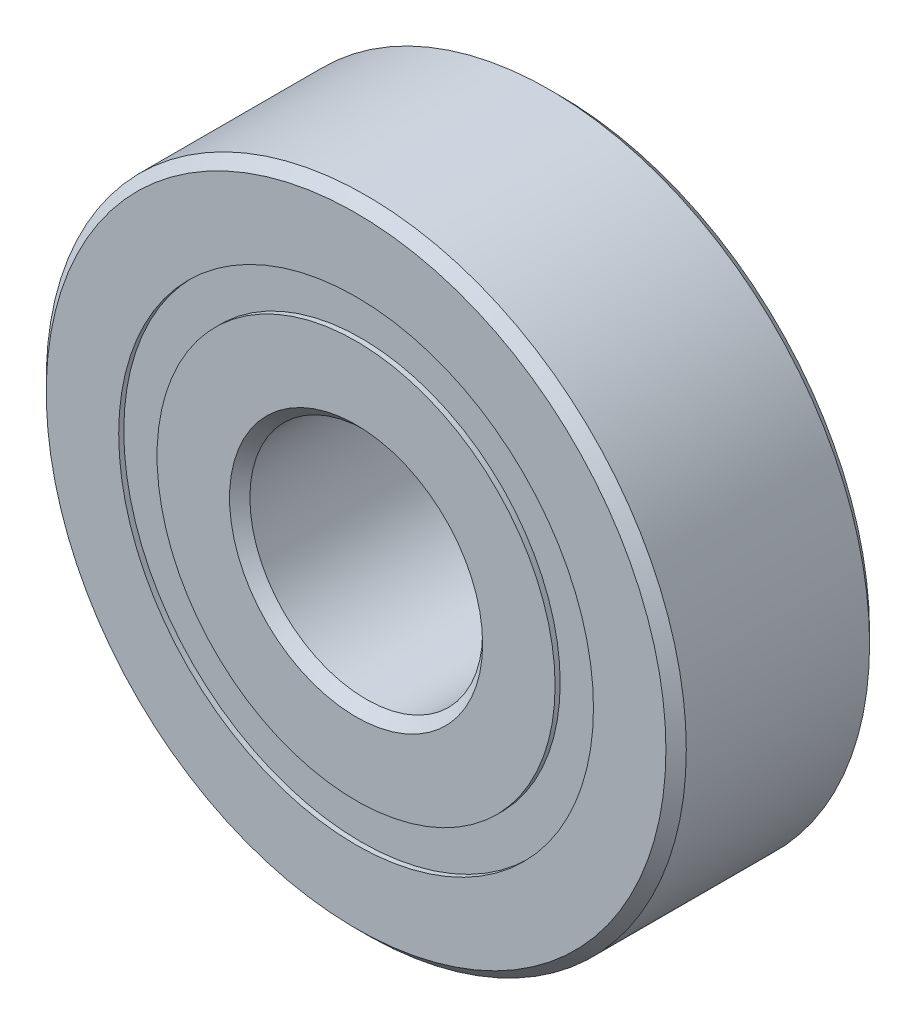
ISO-10303-21;
HEADER;
FILE_DESCRIPTION(('STEP AP214'),'2;1');
FILE_NAME('part.step','',(''),(''),'','','');
FILE_SCHEMA(('AUTOMOTIVE_DESIGN { 1 0 10303 214 1 1 1 1 }'));
ENDSEC;
DATA;
#1=APPLICATION_CONTEXT('core data for automotive mechanical design processes');
#2=APPLICATION_PROTOCOL_DEFINITION('international standard','automotive_design',2000,#1);
#3=PRODUCT_CONTEXT('',#1,'mechanical');
#4=PRODUCT('Part','Part','',(#3));
#5=PRODUCT_RELATED_PRODUCT_CATEGORY('part','',(#4));
#6=PRODUCT_DEFINITION_FORMATION('','',#4);
#7=PRODUCT_DEFINITION_CONTEXT('part definition',#1,'design');
#8=PRODUCT_DEFINITION('design','',#6,#7);
#9=PRODUCT_DEFINITION_SHAPE('','',#8);
#10=(LENGTH_UNIT() NAMED_UNIT(*) SI_UNIT(.MILLI.,.METRE.));
#11=(NAMED_UNIT(*) PLANE_ANGLE_UNIT() SI_UNIT($,.RADIAN.));
#12=(NAMED_UNIT(*) SI_UNIT($,.STERADIAN.) SOLID_ANGLE_UNIT());
#13=UNCERTAINTY_MEASURE_WITH_UNIT(LENGTH_MEASURE(1.E-05),#10,'distance_accuracy_value','');
#14=(GEOMETRIC_REPRESENTATION_CONTEXT(3) GLOBAL_UNCERTAINTY_ASSIGNED_CONTEXT((#13)) GLOBAL_UNIT_ASSIGNED_CONTEXT((#10,
#11,#12)) REPRESENTATION_CONTEXT('',''));
#15=CARTESIAN_POINT('',(0.,0.,0.));
#16=DIRECTION('',(0.,0.,1.));
#17=DIRECTION('',(1.,0.,0.));
#18=AXIS2_PLACEMENT_3D('',#15,#16,#17);
#19=CARTESIAN_POINT('',(0.,8.15934065934066,-3.325));
#20=DIRECTION('',(0.,0.,1.));
#21=DIRECTION('',(1.,0.,0.));
#22=AXIS2_PLACEMENT_3D('',#19,#20,#21);
#23=PLANE('',#22);
#24=CARTESIAN_POINT('',(0.,0.,-3.325));
#25=DIRECTION('',(0.,0.,1.));
#26=DIRECTION('',(1.,0.,0.));
#27=AXIS2_PLACEMENT_3D('',#24,#25,#26);
#28=CIRCLE('',#27,8.15934065934066);
#29=CARTESIAN_POINT('',(8.15934065934066,0.,-3.325));
#30=VERTEX_POINT('',#29);
#31=EDGE_CURVE('E57',#30,#30,#28,.T.);
#32=ORIENTED_EDGE('',*,*,#31,.F.);
#33=EDGE_LOOP('',(#32));
#34=FACE_BOUND('',#33,.T.);
#35=CARTESIAN_POINT('',(0.,0.,-3.325));
#36=DIRECTION('',(0.,0.,1.));
#37=DIRECTION('',(1.,0.,0.));
#38=AXIS2_PLACEMENT_3D('',#35,#36,#37);
#39=CIRCLE('',#38,6.84065934065934);
#40=CARTESIAN_POINT('',(6.84065934065934,0.,-3.325));
#41=VERTEX_POINT('',#40);
#42=EDGE_CURVE('E11',#41,#41,#39,.T.);
#43=ORIENTED_EDGE('',*,*,#42,.T.);
#44=EDGE_LOOP('',(#43));
#45=FACE_BOUND('',#44,.T.);
#46=ADVANCED_FACE('F43',(#34,#45),#23,.F.);
#47=CARTESIAN_POINT('',(0.,0.,3.5));
#48=DIRECTION('',(0.,0.,1.));
#49=DIRECTION('',(1.,0.,0.));
#50=AXIS2_PLACEMENT_3D('',#47,#48,#49);
#51=CYLINDRICAL_SURFACE('',#50,6.84065934065934);
#52=ORIENTED_EDGE('',*,*,#42,.F.);
#53=EDGE_LOOP('',(#52));
#54=FACE_BOUND('',#53,.T.);
#55=CARTESIAN_POINT('',(0.,0.,-1.68952158656808));
#56=DIRECTION('',(0.,0.,1.));
#57=DIRECTION('',(1.,0.,0.));
#58=AXIS2_PLACEMENT_3D('',#55,#56,#57);
#59=CIRCLE('',#58,6.84065934065934);
#60=CARTESIAN_POINT('',(6.84065934065934,0.,-1.68952158656808));
#61=VERTEX_POINT('',#60);
#62=EDGE_CURVE('E49',#61,#61,#59,.T.);
#63=ORIENTED_EDGE('',*,*,#62,.T.);
#64=EDGE_LOOP('',(#63));
#65=FACE_BOUND('',#64,.T.);
#66=ADVANCED_FACE('F66',(#54,#65),#51,.F.);
#67=CARTESIAN_POINT('',(0.,8.15934065934066,-1.68952158656808));
#68=DIRECTION('',(0.,0.,-1.));
#69=DIRECTION('',(-1.,0.,0.));
#70=AXIS2_PLACEMENT_3D('',#67,#68,#69);
#71=PLANE('',#70);
#72=ORIENTED_EDGE('',*,*,#62,.F.);
#73=EDGE_LOOP('',(#72));
#74=FACE_BOUND('',#73,.T.);
#75=CARTESIAN_POINT('',(0.,0.,-1.68952158656808));
#76=DIRECTION('',(0.,0.,1.));
#77=DIRECTION('',(1.,0.,0.));
#78=AXIS2_PLACEMENT_3D('',#75,#76,#77);
#79=CIRCLE('',#78,8.15934065934066);
#80=CARTESIAN_POINT('',(8.15934065934066,0.,-1.68952158656808));
#81=VERTEX_POINT('',#80);
#82=EDGE_CURVE('E53',#81,#81,#79,.T.);
#83=ORIENTED_EDGE('',*,*,#82,.T.);
#84=EDGE_LOOP('',(#83));
#85=FACE_BOUND('',#84,.T.);
#86=ADVANCED_FACE('F70',(#74,#85),#71,.F.);
#87=CARTESIAN_POINT('',(0.,0.,3.5));
#88=DIRECTION('',(0.,0.,1.));
#89=DIRECTION('',(1.,0.,0.));
#90=AXIS2_PLACEMENT_3D('',#87,#88,#89);
#91=CYLINDRICAL_SURFACE('',#90,8.15934065934066);
#92=ORIENTED_EDGE('',*,*,#82,.F.);
#93=EDGE_LOOP('',(#92));
#94=FACE_BOUND('',#93,.T.);
#95=ORIENTED_EDGE('',*,*,#31,.T.);
#96=EDGE_LOOP('',(#95));
#97=FACE_BOUND('',#96,.T.);
#98=ADVANCED_FACE('F63',(#94,#97),#91,.T.);
#99=CLOSED_SHELL('',(#46,#66,#86,#98));
#100=MANIFOLD_SOLID_BREP('B2',#99);
#101=CARTESIAN_POINT('',(0.,8.15934065934066,3.325));
#102=DIRECTION('',(0.,0.,-1.));
#103=DIRECTION('',(-1.,0.,0.));
#104=AXIS2_PLACEMENT_3D('',#101,#102,#103);
#105=PLANE('',#104);
#106=CARTESIAN_POINT('',(0.,0.,3.325));
#107=DIRECTION('',(0.,0.,1.));
#108=DIRECTION('',(1.,0.,0.));
#109=AXIS2_PLACEMENT_3D('',#106,#107,#108);
#110=CIRCLE('',#109,6.84065934065934);
#111=CARTESIAN_POINT('',(6.84065934065934,0.,3.325));
#112=VERTEX_POINT('',#111);
#113=EDGE_CURVE('E42',#112,#112,#110,.T.);
#114=ORIENTED_EDGE('',*,*,#113,.F.);
#115=EDGE_LOOP('',(#114));
#116=FACE_BOUND('',#115,.T.);
#117=CARTESIAN_POINT('',(0.,0.,3.325));
#118=DIRECTION('',(0.,0.,1.));
#119=DIRECTION('',(1.,0.,0.));
#120=AXIS2_PLACEMENT_3D('',#117,#118,#119);
#121=CIRCLE('',#120,8.15934065934066);
#122=CARTESIAN_POINT('',(8.15934065934066,0.,3.325));
#123=VERTEX_POINT('',#122);
#124=EDGE_CURVE('E124',#123,#123,#121,.T.);
#125=ORIENTED_EDGE('',*,*,#124,.T.);
#126=EDGE_LOOP('',(#125));
#127=FACE_BOUND('',#126,.T.);
#128=ADVANCED_FACE('F110',(#116,#127),#105,.F.);
#129=CARTESIAN_POINT('',(0.,0.,3.5));
#130=DIRECTION('',(0.,0.,1.));
#131=DIRECTION('',(1.,0.,0.));
#132=AXIS2_PLACEMENT_3D('',#129,#130,#131);
#133=CYLINDRICAL_SURFACE('',#132,6.84065934065934);
#134=CARTESIAN_POINT('',(0.,0.,1.68952158656808));
#135=DIRECTION('',(0.,0.,1.));
#136=DIRECTION('',(1.,0.,0.));
#137=AXIS2_PLACEMENT_3D('',#134,#135,#136);
#138=CIRCLE('',#137,6.84065934065934);
#139=CARTESIAN_POINT('',(6.84065934065934,0.,1.68952158656808));
#140=VERTEX_POINT('',#139);
#141=EDGE_CURVE('E116',#140,#140,#138,.T.);
#142=ORIENTED_EDGE('',*,*,#141,.F.);
#143=EDGE_LOOP('',(#142));
#144=FACE_BOUND('',#143,.T.);
#145=ORIENTED_EDGE('',*,*,#113,.T.);
#146=EDGE_LOOP('',(#145));
#147=FACE_BOUND('',#146,.T.);
#148=ADVANCED_FACE('F139',(#144,#147),#133,.F.);
#149=CARTESIAN_POINT('',(0.,8.15934065934066,1.68952158656808));
#150=DIRECTION('',(0.,0.,1.));
#151=DIRECTION('',(1.,0.,0.));
#152=AXIS2_PLACEMENT_3D('',#149,#150,#151);
#153=PLANE('',#152);
#154=CARTESIAN_POINT('',(0.,0.,1.68952158656808));
#155=DIRECTION('',(0.,0.,1.));
#156=DIRECTION('',(1.,0.,0.));
#157=AXIS2_PLACEMENT_3D('',#154,#155,#156);
#158=CIRCLE('',#157,8.15934065934066);
#159=CARTESIAN_POINT('',(8.15934065934066,0.,1.68952158656808));
#160=VERTEX_POINT('',#159);
#161=EDGE_CURVE('E120',#160,#160,#158,.T.);
#162=ORIENTED_EDGE('',*,*,#161,.F.);
#163=EDGE_LOOP('',(#162));
#164=FACE_BOUND('',#163,.T.);
#165=ORIENTED_EDGE('',*,*,#141,.T.);
#166=EDGE_LOOP('',(#165));
#167=FACE_BOUND('',#166,.T.);
#168=ADVANCED_FACE('F134',(#164,#167),#153,.F.);
#169=CARTESIAN_POINT('',(0.,0.,3.5));
#170=DIRECTION('',(0.,0.,1.));
#171=DIRECTION('',(1.,0.,0.));
#172=AXIS2_PLACEMENT_3D('',#169,#170,#171);
#173=CYLINDRICAL_SURFACE('',#172,8.15934065934066);
#174=ORIENTED_EDGE('',*,*,#124,.F.);
#175=EDGE_LOOP('',(#174));
#176=FACE_BOUND('',#175,.T.);
#177=ORIENTED_EDGE('',*,*,#161,.T.);
#178=EDGE_LOOP('',(#177));
#179=FACE_BOUND('',#178,.T.);
#180=ADVANCED_FACE('F131',(#176,#179),#173,.T.);
#181=CLOSED_SHELL('',(#128,#148,#168,#180));
#182=MANIFOLD_SOLID_BREP('B6',#181);
#183=CARTESIAN_POINT('',(-3.2541280433816,6.75726650926819,0.));
#184=DIRECTION('',(0.,0.,1.));
#185=DIRECTION('',(-0.433883739117546,0.900968867902425,0.));
#186=AXIS2_PLACEMENT_3D('',#183,#184,#185);
#187=SPHERICAL_SURFACE('',#186,1.68952158656808);
#188=CARTESIAN_POINT('',(-3.2541280433816,6.75726650926819,1.68952158656808));
#189=VERTEX_POINT('',#188);
#190=VERTEX_LOOP('',#189);
#191=FACE_BOUND('',#190,.T.);
#192=ADVANCED_FACE('F177',(#191),#187,.T.);
#193=CLOSED_SHELL('',(#192));
#194=MANIFOLD_SOLID_BREP('B37',#193);
#195=CARTESIAN_POINT('',(-5.86373611851017,4.67617351394057,0.));
#196=DIRECTION('',(0.,0.,1.));
#197=DIRECTION('',(-0.781831482468022,0.623489801858743,0.));
#198=AXIS2_PLACEMENT_3D('',#195,#196,#197);
#199=SPHERICAL_SURFACE('',#198,1.68952158656808);
#200=CARTESIAN_POINT('',(-5.86373611851017,4.67617351394057,1.68952158656808));
#201=VERTEX_POINT('',#200);
#202=VERTEX_LOOP('',#201);
#203=FACE_BOUND('',#202,.T.);
#204=ADVANCED_FACE('F208',(#203),#199,.T.);
#205=CLOSED_SHELL('',(#204));
#206=MANIFOLD_SOLID_BREP('B106',#205);
#207=CARTESIAN_POINT('',(-7.31195934136366,1.66890700467243,0.));
#208=DIRECTION('',(0.,0.,1.));
#209=DIRECTION('',(-0.974927912181821,0.222520933956325,0.));
#210=AXIS2_PLACEMENT_3D('',#207,#208,#209);
#211=SPHERICAL_SURFACE('',#210,1.68952158656808);
#212=CARTESIAN_POINT('',(-7.31195934136366,1.66890700467243,1.68952158656808));
#213=VERTEX_POINT('',#212);
#214=VERTEX_LOOP('',#213);
#215=FACE_BOUND('',#214,.T.);
#216=ADVANCED_FACE('F239',(#215),#211,.T.);
#217=CLOSED_SHELL('',(#216));
#218=MANIFOLD_SOLID_BREP('B173',#217);
#219=CARTESIAN_POINT('',(-7.31195934136369,-1.66890700467229,0.));
#220=DIRECTION('',(0.,0.,1.));
#221=DIRECTION('',(-0.974927912181826,-0.222520933956305,0.));
#222=AXIS2_PLACEMENT_3D('',#219,#220,#221);
#223=SPHERICAL_SURFACE('',#222,1.68952158656808);
#224=CARTESIAN_POINT('',(-7.31195934136369,-1.66890700467229,1.68952158656808));
#225=VERTEX_POINT('',#224);
#226=VERTEX_LOOP('',#225);
#227=FACE_BOUND('',#226,.T.);
#228=ADVANCED_FACE('F270',(#227),#223,.T.);
#229=CLOSED_SHELL('',(#228));
#230=MANIFOLD_SOLID_BREP('B204',#229);
#231=CARTESIAN_POINT('',(-5.86373611851026,-4.67617351394045,0.));
#232=DIRECTION('',(0.,0.,1.));
#233=DIRECTION('',(-0.781831482468035,-0.623489801858727,0.));
#234=AXIS2_PLACEMENT_3D('',#231,#232,#233);
#235=SPHERICAL_SURFACE('',#234,1.68952158656808);
#236=CARTESIAN_POINT('',(-5.86373611851026,-4.67617351394045,1.68952158656808));
#237=VERTEX_POINT('',#236);
#238=VERTEX_LOOP('',#237);
#239=FACE_BOUND('',#238,.T.);
#240=ADVANCED_FACE('F303',(#239),#235,.T.);
#241=CLOSED_SHELL('',(#240));
#242=MANIFOLD_SOLID_BREP('B235',#241);
#243=CARTESIAN_POINT('',(-3.25412804338174,-6.75726650926812,0.));
#244=DIRECTION('',(0.,0.,1.));
#245=DIRECTION('',(-0.433883739117565,-0.900968867902416,0.));
#246=AXIS2_PLACEMENT_3D('',#243,#244,#245);
#247=SPHERICAL_SURFACE('',#246,1.68952158656808);
#248=CARTESIAN_POINT('',(-3.25412804338174,-6.75726650926812,1.68952158656808));
#249=VERTEX_POINT('',#248);
#250=VERTEX_LOOP('',#249);
#251=FACE_BOUND('',#250,.T.);
#252=ADVANCED_FACE('F334',(#251),#247,.T.);
#253=CLOSED_SHELL('',(#252));
#254=MANIFOLD_SOLID_BREP('B266',#253);
#255=CARTESIAN_POINT('',(0.,-7.5,0.));
#256=DIRECTION('',(0.,0.,1.));
#257=DIRECTION('',(0.,-1.,0.));
#258=AXIS2_PLACEMENT_3D('',#255,#256,#257);
#259=SPHERICAL_SURFACE('',#258,1.68952158656808);
#260=CARTESIAN_POINT('',(0.,-7.5,1.68952158656808));
#261=VERTEX_POINT('',#260);
#262=VERTEX_LOOP('',#261);
#263=FACE_BOUND('',#262,.T.);
#264=ADVANCED_FACE('F365',(#263),#259,.T.);
#265=CLOSED_SHELL('',(#264));
#266=MANIFOLD_SOLID_BREP('B299',#265);
#267=CARTESIAN_POINT('',(3.25412804338164,-6.75726650926816,0.));
#268=DIRECTION('',(0.,0.,1.));
#269=DIRECTION('',(0.433883739117553,-0.900968867902422,0.));
#270=AXIS2_PLACEMENT_3D('',#267,#268,#269);
#271=SPHERICAL_SURFACE('',#270,1.68952158656808);
#272=CARTESIAN_POINT('',(3.25412804338164,-6.75726650926816,1.68952158656808));
#273=VERTEX_POINT('',#272);
#274=VERTEX_LOOP('',#273);
#275=FACE_BOUND('',#274,.T.);
#276=ADVANCED_FACE('F398',(#275),#271,.T.);
#277=CLOSED_SHELL('',(#276));
#278=MANIFOLD_SOLID_BREP('B330',#277);
#279=CARTESIAN_POINT('',(5.8637361185102,-4.67617351394053,0.));
#280=DIRECTION('',(0.,0.,1.));
#281=DIRECTION('',(0.781831482468027,-0.623489801858737,0.));
#282=AXIS2_PLACEMENT_3D('',#279,#280,#281);
#283=SPHERICAL_SURFACE('',#282,1.68952158656808);
#284=CARTESIAN_POINT('',(5.8637361185102,-4.67617351394053,1.68952158656808));
#285=VERTEX_POINT('',#284);
#286=VERTEX_LOOP('',#285);
#287=FACE_BOUND('',#286,.T.);
#288=ADVANCED_FACE('F429',(#287),#283,.T.);
#289=CLOSED_SHELL('',(#288));
#290=MANIFOLD_SOLID_BREP('B361',#289);
#291=CARTESIAN_POINT('',(7.31195934136367,-1.66890700467239,0.));
#292=DIRECTION('',(0.,0.,1.));
#293=DIRECTION('',(0.974927912181823,-0.222520933956318,0.));
#294=AXIS2_PLACEMENT_3D('',#291,#292,#293);
#295=SPHERICAL_SURFACE('',#294,1.68952158656808);
#296=CARTESIAN_POINT('',(7.31195934136367,-1.66890700467239,1.68952158656808));
#297=VERTEX_POINT('',#296);
#298=VERTEX_LOOP('',#297);
#299=FACE_BOUND('',#298,.T.);
#300=ADVANCED_FACE('F460',(#299),#295,.T.);
#301=CLOSED_SHELL('',(#300));
#302=MANIFOLD_SOLID_BREP('B394',#301);
#303=CARTESIAN_POINT('',(7.31195934136368,1.66890700467234,0.));
#304=DIRECTION('',(0.,0.,1.));
#305=DIRECTION('',(0.974927912181824,0.222520933956311,0.));
#306=AXIS2_PLACEMENT_3D('',#303,#304,#305);
#307=SPHERICAL_SURFACE('',#306,1.68952158656808);
#308=CARTESIAN_POINT('',(7.31195934136368,1.66890700467234,1.68952158656808));
#309=VERTEX_POINT('',#308);
#310=VERTEX_LOOP('',#309);
#311=FACE_BOUND('',#310,.T.);
#312=ADVANCED_FACE('F491',(#311),#307,.T.);
#313=CLOSED_SHELL('',(#312));
#314=MANIFOLD_SOLID_BREP('B425',#313);
#315=CARTESIAN_POINT('',(5.86373611851023,4.67617351394049,0.));
#316=DIRECTION('',(0.,0.,1.));
#317=DIRECTION('',(0.781831482468031,0.623489801858732,0.));
#318=AXIS2_PLACEMENT_3D('',#315,#316,#317);
#319=SPHERICAL_SURFACE('',#318,1.68952158656808);
#320=CARTESIAN_POINT('',(5.86373611851023,4.67617351394049,1.68952158656808));
#321=VERTEX_POINT('',#320);
#322=VERTEX_LOOP('',#321);
#323=FACE_BOUND('',#322,.T.);
#324=ADVANCED_FACE('F522',(#323),#319,.T.);
#325=CLOSED_SHELL('',(#324));
#326=MANIFOLD_SOLID_BREP('B456',#325);
#327=CARTESIAN_POINT('',(3.25412804338169,6.75726650926814,0.));
#328=DIRECTION('',(0.,0.,1.));
#329=DIRECTION('',(0.433883739117559,0.900968867902419,0.));
#330=AXIS2_PLACEMENT_3D('',#327,#328,#329);
#331=SPHERICAL_SURFACE('',#330,1.68952158656808);
#332=CARTESIAN_POINT('',(3.25412804338169,6.75726650926814,1.68952158656808));
#333=VERTEX_POINT('',#332);
#334=VERTEX_LOOP('',#333);
#335=FACE_BOUND('',#334,.T.);
#336=ADVANCED_FACE('F555',(#335),#331,.T.);
#337=CLOSED_SHELL('',(#336));
#338=MANIFOLD_SOLID_BREP('B487',#337);
#339=CARTESIAN_POINT('',(0.,7.5,0.));
#340=DIRECTION('',(0.,0.,1.));
#341=DIRECTION('',(0.,1.,0.));
#342=AXIS2_PLACEMENT_3D('',#339,#340,#341);
#343=SPHERICAL_SURFACE('',#342,1.68952158656808);
#344=CARTESIAN_POINT('',(0.,7.5,1.68952158656808));
#345=VERTEX_POINT('',#344);
#346=VERTEX_LOOP('',#345);
#347=FACE_BOUND('',#346,.T.);
#348=ADVANCED_FACE('F588',(#347),#343,.T.);
#349=CLOSED_SHELL('',(#348));
#350=MANIFOLD_SOLID_BREP('B518',#349);
#351=CARTESIAN_POINT('',(0.,6.84065934065934,3.5));
#352=DIRECTION('',(0.,0.,-1.));
#353=DIRECTION('',(-1.,0.,0.));
#354=AXIS2_PLACEMENT_3D('',#351,#352,#353);
#355=PLANE('',#354);
#356=CARTESIAN_POINT('',(0.,0.,3.5));
#357=DIRECTION('',(0.,0.,1.));
#358=DIRECTION('',(1.,0.,0.));
#359=AXIS2_PLACEMENT_3D('',#356,#357,#358);
#360=CIRCLE('',#359,4.35);
#361=CARTESIAN_POINT('',(4.35,0.,3.5));
#362=VERTEX_POINT('',#361);
#363=EDGE_CURVE('E635',#362,#362,#360,.T.);
#364=ORIENTED_EDGE('',*,*,#363,.F.);
#365=EDGE_LOOP('',(#364));
#366=FACE_BOUND('',#365,.T.);
#367=CARTESIAN_POINT('',(0.,0.,3.5));
#368=DIRECTION('',(0.,0.,1.));
#369=DIRECTION('',(1.,0.,0.));
#370=AXIS2_PLACEMENT_3D('',#367,#368,#369);
#371=CIRCLE('',#370,6.84065934065934);
#372=CARTESIAN_POINT('',(6.84065934065934,0.,3.5));
#373=VERTEX_POINT('',#372);
#374=EDGE_CURVE('E587',#373,#373,#371,.T.);
#375=ORIENTED_EDGE('',*,*,#374,.T.);
#376=EDGE_LOOP('',(#375));
#377=FACE_BOUND('',#376,.T.);
#378=ADVANCED_FACE('F607',(#366,#377),#355,.F.);
#379=CARTESIAN_POINT('',(0.,0.,3.5));
#380=DIRECTION('',(0.,0.,1.));
#381=DIRECTION('',(1.,0.,0.));
#382=AXIS2_PLACEMENT_3D('',#379,#380,#381);
#383=CYLINDRICAL_SURFACE('',#382,6.84065934065934);
#384=ORIENTED_EDGE('',*,*,#374,.F.);
#385=EDGE_LOOP('',(#384));
#386=FACE_BOUND('',#385,.T.);
#387=CARTESIAN_POINT('',(0.,0.,1.55555555555556));
#388=DIRECTION('',(0.,0.,1.));
#389=DIRECTION('',(1.,0.,0.));
#390=AXIS2_PLACEMENT_3D('',#387,#388,#389);
#391=CIRCLE('',#390,6.84065934065934);
#392=CARTESIAN_POINT('',(6.84065934065934,0.,1.55555555555556));
#393=VERTEX_POINT('',#392);
#394=EDGE_CURVE('E613',#393,#393,#391,.T.);
#395=ORIENTED_EDGE('',*,*,#394,.T.);
#396=EDGE_LOOP('',(#395));
#397=FACE_BOUND('',#396,.T.);
#398=ADVANCED_FACE('F642',(#386,#397),#383,.T.);
#399=CARTESIAN_POINT('',(0.,0.,0.));
#400=DIRECTION('',(0.,0.,1.));
#401=DIRECTION('',(1.,0.,0.));
#402=AXIS2_PLACEMENT_3D('',#399,#400,#401);
#403=TOROIDAL_SURFACE('',#402,7.49999999999999,1.68952158656808);
#404=ORIENTED_EDGE('',*,*,#394,.F.);
#405=EDGE_LOOP('',(#404));
#406=FACE_BOUND('',#405,.T.);
#407=CARTESIAN_POINT('',(0.,0.,-1.55555555555556));
#408=DIRECTION('',(0.,0.,1.));
#409=DIRECTION('',(1.,0.,0.));
#410=AXIS2_PLACEMENT_3D('',#407,#408,#409);
#411=CIRCLE('',#410,6.84065934065934);
#412=CARTESIAN_POINT('',(6.84065934065934,0.,-1.55555555555556));
#413=VERTEX_POINT('',#412);
#414=EDGE_CURVE('E617',#413,#413,#411,.T.);
#415=ORIENTED_EDGE('',*,*,#414,.T.);
#416=EDGE_LOOP('',(#415));
#417=FACE_BOUND('',#416,.T.);
#418=ADVANCED_FACE('F646',(#406,#417),#403,.F.);
#419=CARTESIAN_POINT('',(0.,0.,3.5));
#420=DIRECTION('',(0.,0.,1.));
#421=DIRECTION('',(1.,0.,0.));
#422=AXIS2_PLACEMENT_3D('',#419,#420,#421);
#423=CYLINDRICAL_SURFACE('',#422,6.84065934065934);
#424=ORIENTED_EDGE('',*,*,#414,.F.);
#425=EDGE_LOOP('',(#424));
#426=FACE_BOUND('',#425,.T.);
#427=CARTESIAN_POINT('',(0.,0.,-3.5));
#428=DIRECTION('',(0.,0.,1.));
#429=DIRECTION('',(1.,0.,0.));
#430=AXIS2_PLACEMENT_3D('',#427,#428,#429);
#431=CIRCLE('',#430,6.84065934065934);
#432=CARTESIAN_POINT('',(6.84065934065934,0.,-3.5));
#433=VERTEX_POINT('',#432);
#434=EDGE_CURVE('E621',#433,#433,#431,.T.);
#435=ORIENTED_EDGE('',*,*,#434,.T.);
#436=EDGE_LOOP('',(#435));
#437=FACE_BOUND('',#436,.T.);
#438=ADVANCED_FACE('F651',(#426,#437),#423,.T.);
#439=CARTESIAN_POINT('',(0.,4.35,-3.5));
#440=DIRECTION('',(0.,0.,1.));
#441=DIRECTION('',(1.,0.,0.));
#442=AXIS2_PLACEMENT_3D('',#439,#440,#441);
#443=PLANE('',#442);
#444=ORIENTED_EDGE('',*,*,#434,.F.);
#445=EDGE_LOOP('',(#444));
#446=FACE_BOUND('',#445,.T.);
#447=CARTESIAN_POINT('',(0.,0.,-3.5));
#448=DIRECTION('',(0.,0.,1.));
#449=DIRECTION('',(1.,0.,0.));
#450=AXIS2_PLACEMENT_3D('',#447,#448,#449);
#451=CIRCLE('',#450,4.35);
#452=CARTESIAN_POINT('',(4.35,0.,-3.5));
#453=VERTEX_POINT('',#452);
#454=EDGE_CURVE('E626',#453,#453,#451,.T.);
#455=ORIENTED_EDGE('',*,*,#454,.T.);
#456=EDGE_LOOP('',(#455));
#457=FACE_BOUND('',#456,.T.);
#458=ADVANCED_FACE('F657',(#446,#457),#443,.F.);
#459=CARTESIAN_POINT('',(0.,0.,-3.15));
#460=DIRECTION('',(0.,0.,-1.));
#461=DIRECTION('',(-1.,0.,0.));
#462=AXIS2_PLACEMENT_3D('',#459,#460,#461);
#463=CONICAL_SURFACE('',#462,4.,0.785398163397448);
#464=ORIENTED_EDGE('',*,*,#454,.F.);
#465=EDGE_LOOP('',(#464));
#466=FACE_BOUND('',#465,.T.);
#467=CARTESIAN_POINT('',(0.,0.,-3.15));
#468=DIRECTION('',(0.,0.,1.));
#469=DIRECTION('',(1.,0.,0.));
#470=AXIS2_PLACEMENT_3D('',#467,#468,#469);
#471=CIRCLE('',#470,4.);
#472=CARTESIAN_POINT('',(4.,0.,-3.15));
#473=VERTEX_POINT('',#472);
#474=EDGE_CURVE('E629',#473,#473,#471,.T.);
#475=ORIENTED_EDGE('',*,*,#474,.T.);
#476=EDGE_LOOP('',(#475));
#477=FACE_BOUND('',#476,.T.);
#478=ADVANCED_FACE('F661',(#466,#477),#463,.F.);
#479=CARTESIAN_POINT('',(0.,0.,3.5));
#480=DIRECTION('',(0.,0.,1.));
#481=DIRECTION('',(1.,0.,0.));
#482=AXIS2_PLACEMENT_3D('',#479,#480,#481);
#483=CYLINDRICAL_SURFACE('',#482,4.);
#484=ORIENTED_EDGE('',*,*,#474,.F.);
#485=EDGE_LOOP('',(#484));
#486=FACE_BOUND('',#485,.T.);
#487=CARTESIAN_POINT('',(0.,0.,3.15));
#488=DIRECTION('',(0.,0.,1.));
#489=DIRECTION('',(1.,0.,0.));
#490=AXIS2_PLACEMENT_3D('',#487,#488,#489);
#491=CIRCLE('',#490,4.);
#492=CARTESIAN_POINT('',(4.,0.,3.15));
#493=VERTEX_POINT('',#492);
#494=EDGE_CURVE('E632',#493,#493,#491,.T.);
#495=ORIENTED_EDGE('',*,*,#494,.T.);
#496=EDGE_LOOP('',(#495));
#497=FACE_BOUND('',#496,.T.);
#498=ADVANCED_FACE('F665',(#486,#497),#483,.F.);
#499=CARTESIAN_POINT('',(0.,0.,3.5));
#500=DIRECTION('',(0.,0.,1.));
#501=DIRECTION('',(1.,0.,0.));
#502=AXIS2_PLACEMENT_3D('',#499,#500,#501);
#503=CONICAL_SURFACE('',#502,4.35,0.785398163397448);
#504=ORIENTED_EDGE('',*,*,#494,.F.);
#505=EDGE_LOOP('',(#504));
#506=FACE_BOUND('',#505,.T.);
#507=ORIENTED_EDGE('',*,*,#363,.T.);
#508=EDGE_LOOP('',(#507));
#509=FACE_BOUND('',#508,.T.);
#510=ADVANCED_FACE('F639',(#506,#509),#503,.F.);
#511=CLOSED_SHELL('',(#378,#398,#418,#438,#458,#478,#498,#510));
#512=MANIFOLD_SOLID_BREP('B551',#511);
#513=CARTESIAN_POINT('',(0.,0.,3.15));
#514=DIRECTION('',(0.,0.,-1.));
#515=DIRECTION('',(-1.,0.,0.));
#516=AXIS2_PLACEMENT_3D('',#513,#514,#515);
#517=CONICAL_SURFACE('',#516,11.,0.785398163397448);
#518=CARTESIAN_POINT('',(0.,0.,3.5));
#519=DIRECTION('',(0.,0.,1.));
#520=DIRECTION('',(1.,0.,0.));
#521=AXIS2_PLACEMENT_3D('',#518,#519,#520);
#522=CIRCLE('',#521,10.65);
#523=CARTESIAN_POINT('',(10.65,0.,3.5));
#524=VERTEX_POINT('',#523);
#525=EDGE_CURVE('E756',#524,#524,#522,.T.);
#526=ORIENTED_EDGE('',*,*,#525,.F.);
#527=EDGE_LOOP('',(#526));
#528=FACE_BOUND('',#527,.T.);
#529=CARTESIAN_POINT('',(0.,0.,3.15));
#530=DIRECTION('',(0.,0.,1.));
#531=DIRECTION('',(1.,0.,0.));
#532=AXIS2_PLACEMENT_3D('',#529,#530,#531);
#533=CIRCLE('',#532,11.);
#534=CARTESIAN_POINT('',(11.,0.,3.15));
#535=VERTEX_POINT('',#534);
#536=EDGE_CURVE('E606',#535,#535,#533,.T.);
#537=ORIENTED_EDGE('',*,*,#536,.T.);
#538=EDGE_LOOP('',(#537));
#539=FACE_BOUND('',#538,.T.);
#540=ADVANCED_FACE('F728',(#528,#539),#517,.T.);
#541=CARTESIAN_POINT('',(0.,0.,3.5));
#542=DIRECTION('',(0.,0.,1.));
#543=DIRECTION('',(1.,0.,0.));
#544=AXIS2_PLACEMENT_3D('',#541,#542,#543);
#545=CYLINDRICAL_SURFACE('',#544,11.);
#546=ORIENTED_EDGE('',*,*,#536,.F.);
#547=EDGE_LOOP('',(#546));
#548=FACE_BOUND('',#547,.T.);
#549=CARTESIAN_POINT('',(0.,0.,-3.15));
#550=DIRECTION('',(0.,0.,1.));
#551=DIRECTION('',(1.,0.,0.));
#552=AXIS2_PLACEMENT_3D('',#549,#550,#551);
#553=CIRCLE('',#552,11.);
#554=CARTESIAN_POINT('',(11.,0.,-3.15));
#555=VERTEX_POINT('',#554);
#556=EDGE_CURVE('E734',#555,#555,#553,.T.);
#557=ORIENTED_EDGE('',*,*,#556,.T.);
#558=EDGE_LOOP('',(#557));
#559=FACE_BOUND('',#558,.T.);
#560=ADVANCED_FACE('F763',(#548,#559),#545,.T.);
#561=CARTESIAN_POINT('',(0.,0.,-3.5));
#562=DIRECTION('',(0.,0.,1.));
#563=DIRECTION('',(1.,0.,0.));
#564=AXIS2_PLACEMENT_3D('',#561,#562,#563);
#565=CONICAL_SURFACE('',#564,10.65,0.785398163397448);
#566=ORIENTED_EDGE('',*,*,#556,.F.);
#567=EDGE_LOOP('',(#566));
#568=FACE_BOUND('',#567,.T.);
#569=CARTESIAN_POINT('',(0.,0.,-3.5));
#570=DIRECTION('',(0.,0.,1.));
#571=DIRECTION('',(1.,0.,0.));
#572=AXIS2_PLACEMENT_3D('',#569,#570,#571);
#573=CIRCLE('',#572,10.65);
#574=CARTESIAN_POINT('',(10.65,0.,-3.5));
#575=VERTEX_POINT('',#574);
#576=EDGE_CURVE('E738',#575,#575,#573,.T.);
#577=ORIENTED_EDGE('',*,*,#576,.T.);
#578=EDGE_LOOP('',(#577));
#579=FACE_BOUND('',#578,.T.);
#580=ADVANCED_FACE('F767',(#568,#579),#565,.T.);
#581=CARTESIAN_POINT('',(0.,10.65,-3.5));
#582=DIRECTION('',(0.,0.,1.));
#583=DIRECTION('',(1.,0.,0.));
#584=AXIS2_PLACEMENT_3D('',#581,#582,#583);
#585=PLANE('',#584);
#586=ORIENTED_EDGE('',*,*,#576,.F.);
#587=EDGE_LOOP('',(#586));
#588=FACE_BOUND('',#587,.T.);
#589=CARTESIAN_POINT('',(0.,0.,-3.5));
#590=DIRECTION('',(0.,0.,1.));
#591=DIRECTION('',(1.,0.,0.));
#592=AXIS2_PLACEMENT_3D('',#589,#590,#591);
#593=CIRCLE('',#592,8.15934065934066);
#594=CARTESIAN_POINT('',(8.15934065934066,0.,-3.5));
#595=VERTEX_POINT('',#594);
#596=EDGE_CURVE('E742',#595,#595,#593,.T.);
#597=ORIENTED_EDGE('',*,*,#596,.T.);
#598=EDGE_LOOP('',(#597));
#599=FACE_BOUND('',#598,.T.);
#600=ADVANCED_FACE('F772',(#588,#599),#585,.F.);
#601=CARTESIAN_POINT('',(0.,0.,3.5));
#602=DIRECTION('',(0.,0.,1.));
#603=DIRECTION('',(1.,0.,0.));
#604=AXIS2_PLACEMENT_3D('',#601,#602,#603);
#605=CYLINDRICAL_SURFACE('',#604,8.15934065934066);
#606=ORIENTED_EDGE('',*,*,#596,.F.);
#607=EDGE_LOOP('',(#606));
#608=FACE_BOUND('',#607,.T.);
#609=CARTESIAN_POINT('',(0.,0.,-1.55555555555556));
#610=DIRECTION('',(0.,0.,1.));
#611=DIRECTION('',(1.,0.,0.));
#612=AXIS2_PLACEMENT_3D('',#609,#610,#611);
#613=CIRCLE('',#612,8.15934065934066);
#614=CARTESIAN_POINT('',(8.15934065934066,0.,-1.55555555555556));
#615=VERTEX_POINT('',#614);
#616=EDGE_CURVE('E747',#615,#615,#613,.T.);
#617=ORIENTED_EDGE('',*,*,#616,.T.);
#618=EDGE_LOOP('',(#617));
#619=FACE_BOUND('',#618,.T.);
#620=ADVANCED_FACE('F778',(#608,#619),#605,.F.);
#621=CARTESIAN_POINT('',(0.,0.,0.));
#622=DIRECTION('',(0.,0.,1.));
#623=DIRECTION('',(1.,0.,0.));
#624=AXIS2_PLACEMENT_3D('',#621,#622,#623);
#625=TOROIDAL_SURFACE('',#624,7.5,1.68952158656808);
#626=ORIENTED_EDGE('',*,*,#616,.F.);
#627=EDGE_LOOP('',(#626));
#628=FACE_BOUND('',#627,.T.);
#629=CARTESIAN_POINT('',(0.,0.,1.55555555555556));
#630=DIRECTION('',(0.,0.,1.));
#631=DIRECTION('',(1.,0.,0.));
#632=AXIS2_PLACEMENT_3D('',#629,#630,#631);
#633=CIRCLE('',#632,8.15934065934066);
#634=CARTESIAN_POINT('',(8.15934065934066,0.,1.55555555555556));
#635=VERTEX_POINT('',#634);
#636=EDGE_CURVE('E750',#635,#635,#633,.T.);
#637=ORIENTED_EDGE('',*,*,#636,.T.);
#638=EDGE_LOOP('',(#637));
#639=FACE_BOUND('',#638,.T.);
#640=ADVANCED_FACE('F782',(#628,#639),#625,.F.);
#641=CARTESIAN_POINT('',(0.,0.,3.5));
#642=DIRECTION('',(0.,0.,1.));
#643=DIRECTION('',(1.,0.,0.));
#644=AXIS2_PLACEMENT_3D('',#641,#642,#643);
#645=CYLINDRICAL_SURFACE('',#644,8.15934065934066);
#646=ORIENTED_EDGE('',*,*,#636,.F.);
#647=EDGE_LOOP('',(#646));
#648=FACE_BOUND('',#647,.T.);
#649=CARTESIAN_POINT('',(0.,0.,3.5));
#650=DIRECTION('',(0.,0.,1.));
#651=DIRECTION('',(1.,0.,0.));
#652=AXIS2_PLACEMENT_3D('',#649,#650,#651);
#653=CIRCLE('',#652,8.15934065934066);
#654=CARTESIAN_POINT('',(8.15934065934066,0.,3.5));
#655=VERTEX_POINT('',#654);
#656=EDGE_CURVE('E753',#655,#655,#653,.T.);
#657=ORIENTED_EDGE('',*,*,#656,.T.);
#658=EDGE_LOOP('',(#657));
#659=FACE_BOUND('',#658,.T.);
#660=ADVANCED_FACE('F786',(#648,#659),#645,.F.);
#661=CARTESIAN_POINT('',(0.,10.65,3.5));
#662=DIRECTION('',(0.,0.,-1.));
#663=DIRECTION('',(-1.,0.,0.));
#664=AXIS2_PLACEMENT_3D('',#661,#662,#663);
#665=PLANE('',#664);
#666=ORIENTED_EDGE('',*,*,#656,.F.);
#667=EDGE_LOOP('',(#666));
#668=FACE_BOUND('',#667,.T.);
#669=ORIENTED_EDGE('',*,*,#525,.T.);
#670=EDGE_LOOP('',(#669));
#671=FACE_BOUND('',#670,.T.);
#672=ADVANCED_FACE('F760',(#668,#671),#665,.F.);
#673=CLOSED_SHELL('',(#540,#560,#580,#600,#620,#640,#660,#672));
#674=MANIFOLD_SOLID_BREP('B582',#673);
#675=ADVANCED_BREP_SHAPE_REPRESENTATION('',(#18,#100,#182,#194,#206,#218,#230,#242,#254,#266,
#278,#290,#302,#314,#326,#338,#350,#512,#674),#14);
#676=SHAPE_DEFINITION_REPRESENTATION(#9,#675);
ENDSEC;
END-ISO-10303-21;
